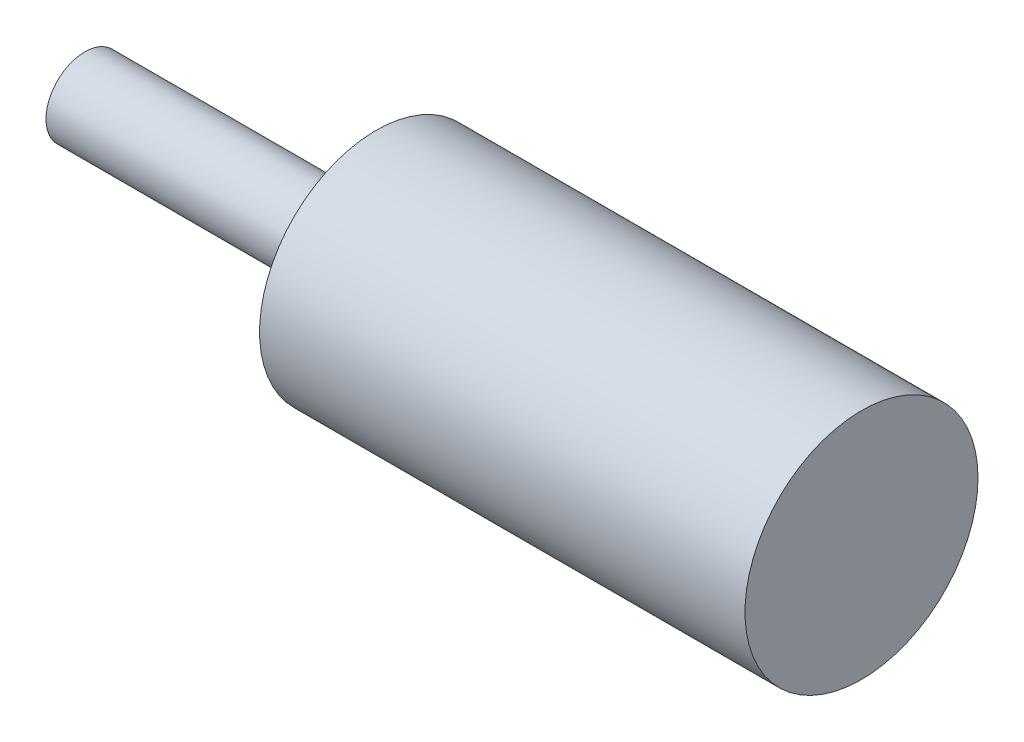
ISO-10303-21;
HEADER;
FILE_DESCRIPTION(('STEP AP214'),'2;1');
FILE_NAME('part.step','',(''),(''),'','','');
FILE_SCHEMA(('AUTOMOTIVE_DESIGN { 1 0 10303 214 1 1 1 1 }'));
ENDSEC;
DATA;
#1=APPLICATION_CONTEXT('core data for automotive mechanical design processes');
#2=APPLICATION_PROTOCOL_DEFINITION('international standard','automotive_design',2000,#1);
#3=PRODUCT_CONTEXT('',#1,'mechanical');
#4=PRODUCT('Part','Part','',(#3));
#5=PRODUCT_RELATED_PRODUCT_CATEGORY('part','',(#4));
#6=PRODUCT_DEFINITION_FORMATION('','',#4);
#7=PRODUCT_DEFINITION_CONTEXT('part definition',#1,'design');
#8=PRODUCT_DEFINITION('design','',#6,#7);
#9=PRODUCT_DEFINITION_SHAPE('','',#8);
#10=(LENGTH_UNIT() NAMED_UNIT(*) SI_UNIT(.MILLI.,.METRE.));
#11=(NAMED_UNIT(*) PLANE_ANGLE_UNIT() SI_UNIT($,.RADIAN.));
#12=(NAMED_UNIT(*) SI_UNIT($,.STERADIAN.) SOLID_ANGLE_UNIT());
#13=UNCERTAINTY_MEASURE_WITH_UNIT(LENGTH_MEASURE(1.E-05),#10,'distance_accuracy_value','');
#14=(GEOMETRIC_REPRESENTATION_CONTEXT(3) GLOBAL_UNCERTAINTY_ASSIGNED_CONTEXT((#13)) GLOBAL_UNIT_ASSIGNED_CONTEXT((#10,
#11,#12)) REPRESENTATION_CONTEXT('',''));
#15=CARTESIAN_POINT('',(0.,0.,0.));
#16=DIRECTION('',(0.,0.,1.));
#17=DIRECTION('',(1.,0.,0.));
#18=AXIS2_PLACEMENT_3D('',#15,#16,#17);
#19=CARTESIAN_POINT('',(0.,0.,0.));
#20=DIRECTION('',(1.,0.,0.));
#21=DIRECTION('',(0.,0.,-1.));
#22=AXIS2_PLACEMENT_3D('',#19,#20,#21);
#23=PLANE('',#22);
#24=CARTESIAN_POINT('',(0.,0.,0.));
#25=DIRECTION('',(1.,0.,0.));
#26=DIRECTION('',(0.,0.,-1.));
#27=AXIS2_PLACEMENT_3D('',#24,#25,#26);
#28=CIRCLE('',#27,3.);
#29=CARTESIAN_POINT('',(0.,0.,-3.));
#30=VERTEX_POINT('',#29);
#31=EDGE_CURVE('E10',#30,#30,#28,.T.);
#32=ORIENTED_EDGE('',*,*,#31,.T.);
#33=EDGE_LOOP('',(#32));
#34=FACE_BOUND('',#33,.T.);
#35=CARTESIAN_POINT('',(0.,0.,0.));
#36=DIRECTION('',(1.,0.,0.));
#37=DIRECTION('',(0.,0.,-1.));
#38=AXIS2_PLACEMENT_3D('',#35,#36,#37);
#39=CIRCLE('',#38,6.);
#40=CARTESIAN_POINT('',(0.,0.,-6.));
#41=VERTEX_POINT('',#40);
#42=EDGE_CURVE('E46',#41,#41,#39,.T.);
#43=ORIENTED_EDGE('',*,*,#42,.F.);
#44=EDGE_LOOP('',(#43));
#45=FACE_BOUND('',#44,.T.);
#46=ADVANCED_FACE('F31',(#34,#45),#23,.F.);
#47=CARTESIAN_POINT('',(25.,0.,0.));
#48=DIRECTION('',(-1.,0.,0.));
#49=DIRECTION('',(0.,0.,1.));
#50=AXIS2_PLACEMENT_3D('',#47,#48,#49);
#51=CYLINDRICAL_SURFACE('',#50,6.);
#52=CARTESIAN_POINT('',(25.,0.,0.));
#53=DIRECTION('',(1.,0.,0.));
#54=DIRECTION('',(0.,0.,-1.));
#55=AXIS2_PLACEMENT_3D('',#52,#53,#54);
#56=CIRCLE('',#55,6.);
#57=CARTESIAN_POINT('',(25.,0.,-6.));
#58=VERTEX_POINT('',#57);
#59=EDGE_CURVE('E42',#58,#58,#56,.T.);
#60=ORIENTED_EDGE('',*,*,#59,.F.);
#61=EDGE_LOOP('',(#60));
#62=FACE_BOUND('',#61,.T.);
#63=ORIENTED_EDGE('',*,*,#42,.T.);
#64=EDGE_LOOP('',(#63));
#65=FACE_BOUND('',#64,.T.);
#66=ADVANCED_FACE('F66',(#62,#65),#51,.T.);
#67=CARTESIAN_POINT('',(25.,0.,0.));
#68=DIRECTION('',(1.,0.,0.));
#69=DIRECTION('',(0.,0.,-1.));
#70=AXIS2_PLACEMENT_3D('',#67,#68,#69);
#71=PLANE('',#70);
#72=ORIENTED_EDGE('',*,*,#59,.T.);
#73=EDGE_LOOP('',(#72));
#74=FACE_BOUND('',#73,.T.);
#75=ADVANCED_FACE('F59',(#74),#71,.T.);
#76=CARTESIAN_POINT('',(-15.,0.,0.));
#77=DIRECTION('',(1.,0.,0.));
#78=DIRECTION('',(0.,0.,-1.));
#79=AXIS2_PLACEMENT_3D('',#76,#77,#78);
#80=CYLINDRICAL_SURFACE('',#79,2.);
#81=CARTESIAN_POINT('',(-1.,0.,0.));
#82=DIRECTION('',(1.,0.,0.));
#83=DIRECTION('',(0.,0.,-1.));
#84=AXIS2_PLACEMENT_3D('',#81,#82,#83);
#85=CIRCLE('',#84,2.);
#86=CARTESIAN_POINT('',(-1.,0.,-2.));
#87=VERTEX_POINT('',#86);
#88=EDGE_CURVE('E38',#87,#87,#85,.F.);
#89=ORIENTED_EDGE('',*,*,#88,.T.);
#90=EDGE_LOOP('',(#89));
#91=FACE_BOUND('',#90,.T.);
#92=CARTESIAN_POINT('',(-15.,0.,0.));
#93=DIRECTION('',(-1.,0.,0.));
#94=DIRECTION('',(0.,0.,1.));
#95=AXIS2_PLACEMENT_3D('',#92,#93,#94);
#96=CIRCLE('',#95,2.);
#97=CARTESIAN_POINT('',(-15.,0.,2.));
#98=VERTEX_POINT('',#97);
#99=EDGE_CURVE('E50',#98,#98,#96,.T.);
#100=ORIENTED_EDGE('',*,*,#99,.F.);
#101=EDGE_LOOP('',(#100));
#102=FACE_BOUND('',#101,.T.);
#103=ADVANCED_FACE('F57',(#91,#102),#80,.T.);
#104=CARTESIAN_POINT('',(-15.,0.,0.));
#105=DIRECTION('',(-1.,0.,0.));
#106=DIRECTION('',(0.,0.,1.));
#107=AXIS2_PLACEMENT_3D('',#104,#105,#106);
#108=PLANE('',#107);
#109=ORIENTED_EDGE('',*,*,#99,.T.);
#110=EDGE_LOOP('',(#109));
#111=FACE_BOUND('',#110,.T.);
#112=ADVANCED_FACE('F55',(#111),#108,.T.);
#113=CARTESIAN_POINT('',(-1.,0.,0.));
#114=DIRECTION('',(1.,0.,0.));
#115=DIRECTION('',(0.,0.,-1.));
#116=AXIS2_PLACEMENT_3D('',#113,#114,#115);
#117=TOROIDAL_SURFACE('',#116,3.,1.);
#118=ORIENTED_EDGE('',*,*,#31,.F.);
#119=EDGE_LOOP('',(#118));
#120=FACE_BOUND('',#119,.T.);
#121=ORIENTED_EDGE('',*,*,#88,.F.);
#122=EDGE_LOOP('',(#121));
#123=FACE_BOUND('',#122,.T.);
#124=ADVANCED_FACE('F33',(#120,#123),#117,.F.);
#125=CLOSED_SHELL('',(#46,#66,#75,#103,#112,#124));
#126=MANIFOLD_SOLID_BREP('B2',#125);
#127=ADVANCED_BREP_SHAPE_REPRESENTATION('',(#18,#126),#14);
#128=SHAPE_DEFINITION_REPRESENTATION(#9,#127);
ENDSEC;
END-ISO-10303-21;
